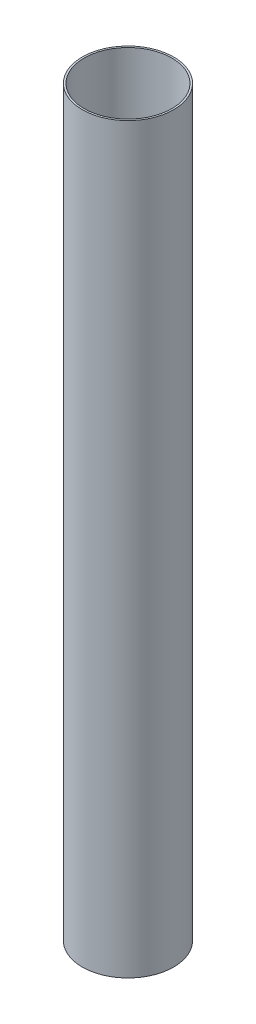
ISO-10303-21;
HEADER;
FILE_DESCRIPTION(('STEP AP214'),'2;1');
FILE_NAME('part.step','',(''),(''),'','','');
FILE_SCHEMA(('AUTOMOTIVE_DESIGN { 1 0 10303 214 1 1 1 1 }'));
ENDSEC;
DATA;
#1=APPLICATION_CONTEXT('core data for automotive mechanical design processes');
#2=APPLICATION_PROTOCOL_DEFINITION('international standard','automotive_design',2000,#1);
#3=PRODUCT_CONTEXT('',#1,'mechanical');
#4=PRODUCT('Part','Part','',(#3));
#5=PRODUCT_RELATED_PRODUCT_CATEGORY('part','',(#4));
#6=PRODUCT_DEFINITION_FORMATION('','',#4);
#7=PRODUCT_DEFINITION_CONTEXT('part definition',#1,'design');
#8=PRODUCT_DEFINITION('design','',#6,#7);
#9=PRODUCT_DEFINITION_SHAPE('','',#8);
#10=(LENGTH_UNIT() NAMED_UNIT(*) SI_UNIT(.MILLI.,.METRE.));
#11=(NAMED_UNIT(*) PLANE_ANGLE_UNIT() SI_UNIT($,.RADIAN.));
#12=(NAMED_UNIT(*) SI_UNIT($,.STERADIAN.) SOLID_ANGLE_UNIT());
#13=UNCERTAINTY_MEASURE_WITH_UNIT(LENGTH_MEASURE(1.E-05),#10,'distance_accuracy_value','');
#14=(GEOMETRIC_REPRESENTATION_CONTEXT(3) GLOBAL_UNCERTAINTY_ASSIGNED_CONTEXT((#13)) GLOBAL_UNIT_ASSIGNED_CONTEXT((#10,
#11,#12)) REPRESENTATION_CONTEXT('',''));
#15=CARTESIAN_POINT('',(0.,0.,0.));
#16=DIRECTION('',(0.,0.,1.));
#17=DIRECTION('',(1.,0.,0.));
#18=AXIS2_PLACEMENT_3D('',#15,#16,#17);
#19=CARTESIAN_POINT('',(0.,123.620053705202,0.));
#20=DIRECTION('',(0.,1.,0.));
#21=DIRECTION('',(0.,0.,1.));
#22=AXIS2_PLACEMENT_3D('',#19,#20,#21);
#23=CYLINDRICAL_SURFACE('',#22,51.5874);
#24=CARTESIAN_POINT('',(0.,838.2,0.));
#25=DIRECTION('',(0.,1.,0.));
#26=DIRECTION('',(0.,0.,1.));
#27=AXIS2_PLACEMENT_3D('',#24,#25,#26);
#28=CIRCLE('',#27,51.5874);
#29=CARTESIAN_POINT('',(0.,838.2,51.5874));
#30=VERTEX_POINT('',#29);
#31=EDGE_CURVE('E10',#30,#30,#28,.T.);
#32=ORIENTED_EDGE('',*,*,#31,.F.);
#33=EDGE_LOOP('',(#32));
#34=FACE_BOUND('',#33,.T.);
#35=CARTESIAN_POINT('',(0.,0.,0.));
#36=DIRECTION('',(0.,1.,0.));
#37=DIRECTION('',(0.,0.,1.));
#38=AXIS2_PLACEMENT_3D('',#35,#36,#37);
#39=CIRCLE('',#38,51.5874);
#40=CARTESIAN_POINT('',(0.,0.,51.5874));
#41=VERTEX_POINT('',#40);
#42=EDGE_CURVE('E58',#41,#41,#39,.T.);
#43=ORIENTED_EDGE('',*,*,#42,.T.);
#44=EDGE_LOOP('',(#43));
#45=FACE_BOUND('',#44,.T.);
#46=ADVANCED_FACE('F41',(#34,#45),#23,.T.);
#47=CARTESIAN_POINT('',(51.5874,838.2,0.));
#48=DIRECTION('',(0.,-1.,0.));
#49=DIRECTION('',(0.,0.,-1.));
#50=AXIS2_PLACEMENT_3D('',#47,#48,#49);
#51=PLANE('',#50);
#52=CARTESIAN_POINT('',(0.,838.2,0.));
#53=DIRECTION('',(0.,1.,0.));
#54=DIRECTION('',(0.,0.,1.));
#55=AXIS2_PLACEMENT_3D('',#52,#53,#54);
#56=CIRCLE('',#55,49.53);
#57=CARTESIAN_POINT('',(0.,838.2,49.53));
#58=VERTEX_POINT('',#57);
#59=EDGE_CURVE('E48',#58,#58,#56,.T.);
#60=ORIENTED_EDGE('',*,*,#59,.F.);
#61=EDGE_LOOP('',(#60));
#62=FACE_BOUND('',#61,.T.);
#63=ORIENTED_EDGE('',*,*,#31,.T.);
#64=EDGE_LOOP('',(#63));
#65=FACE_BOUND('',#64,.T.);
#66=ADVANCED_FACE('F74',(#62,#65),#51,.F.);
#67=CARTESIAN_POINT('',(0.,123.620053705202,0.));
#68=DIRECTION('',(0.,1.,0.));
#69=DIRECTION('',(0.,0.,1.));
#70=AXIS2_PLACEMENT_3D('',#67,#68,#69);
#71=CYLINDRICAL_SURFACE('',#70,49.53);
#72=CARTESIAN_POINT('',(0.,0.,0.));
#73=DIRECTION('',(0.,1.,0.));
#74=DIRECTION('',(0.,0.,1.));
#75=AXIS2_PLACEMENT_3D('',#72,#73,#74);
#76=CIRCLE('',#75,49.53);
#77=CARTESIAN_POINT('',(0.,0.,49.53));
#78=VERTEX_POINT('',#77);
#79=EDGE_CURVE('E53',#78,#78,#76,.T.);
#80=ORIENTED_EDGE('',*,*,#79,.F.);
#81=EDGE_LOOP('',(#80));
#82=FACE_BOUND('',#81,.T.);
#83=ORIENTED_EDGE('',*,*,#59,.T.);
#84=EDGE_LOOP('',(#83));
#85=FACE_BOUND('',#84,.T.);
#86=ADVANCED_FACE('F69',(#82,#85),#71,.F.);
#87=CARTESIAN_POINT('',(49.53,0.,0.));
#88=DIRECTION('',(0.,1.,0.));
#89=DIRECTION('',(0.,0.,1.));
#90=AXIS2_PLACEMENT_3D('',#87,#88,#89);
#91=PLANE('',#90);
#92=ORIENTED_EDGE('',*,*,#42,.F.);
#93=EDGE_LOOP('',(#92));
#94=FACE_BOUND('',#93,.T.);
#95=ORIENTED_EDGE('',*,*,#79,.T.);
#96=EDGE_LOOP('',(#95));
#97=FACE_BOUND('',#96,.T.);
#98=ADVANCED_FACE('F66',(#94,#97),#91,.F.);
#99=CLOSED_SHELL('',(#46,#66,#86,#98));
#100=MANIFOLD_SOLID_BREP('B2',#99);
#101=ADVANCED_BREP_SHAPE_REPRESENTATION('',(#18,#100),#14);
#102=SHAPE_DEFINITION_REPRESENTATION(#9,#101);
ENDSEC;
END-ISO-10303-21;
